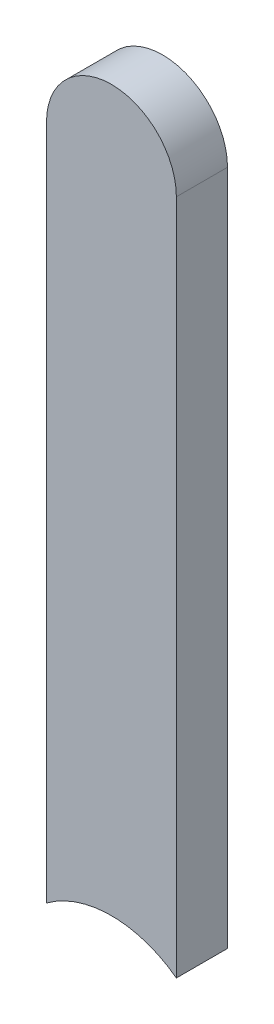
ISO-10303-21;
HEADER;
FILE_DESCRIPTION(('STEP AP214'),'2;1');
FILE_NAME('part.step','',(''),(''),'','','');
FILE_SCHEMA(('AUTOMOTIVE_DESIGN { 1 0 10303 214 1 1 1 1 }'));
ENDSEC;
DATA;
#1=APPLICATION_CONTEXT('core data for automotive mechanical design processes');
#2=APPLICATION_PROTOCOL_DEFINITION('international standard','automotive_design',2000,#1);
#3=PRODUCT_CONTEXT('',#1,'mechanical');
#4=PRODUCT('Part','Part','',(#3));
#5=PRODUCT_RELATED_PRODUCT_CATEGORY('part','',(#4));
#6=PRODUCT_DEFINITION_FORMATION('','',#4);
#7=PRODUCT_DEFINITION_CONTEXT('part definition',#1,'design');
#8=PRODUCT_DEFINITION('design','',#6,#7);
#9=PRODUCT_DEFINITION_SHAPE('','',#8);
#10=(LENGTH_UNIT() NAMED_UNIT(*) SI_UNIT(.MILLI.,.METRE.));
#11=(NAMED_UNIT(*) PLANE_ANGLE_UNIT() SI_UNIT($,.RADIAN.));
#12=(NAMED_UNIT(*) SI_UNIT($,.STERADIAN.) SOLID_ANGLE_UNIT());
#13=UNCERTAINTY_MEASURE_WITH_UNIT(LENGTH_MEASURE(1.E-05),#10,'distance_accuracy_value','');
#14=(GEOMETRIC_REPRESENTATION_CONTEXT(3) GLOBAL_UNCERTAINTY_ASSIGNED_CONTEXT((#13)) GLOBAL_UNIT_ASSIGNED_CONTEXT((#10,
#11,#12)) REPRESENTATION_CONTEXT('',''));
#15=CARTESIAN_POINT('',(0.,0.,0.));
#16=DIRECTION('',(0.,0.,1.));
#17=DIRECTION('',(1.,0.,0.));
#18=AXIS2_PLACEMENT_3D('',#15,#16,#17);
#19=CARTESIAN_POINT('',(110.744,108.732149431103,0.));
#20=DIRECTION('',(-1.,0.,0.));
#21=DIRECTION('',(0.,1.,0.));
#22=AXIS2_PLACEMENT_3D('',#19,#20,#21);
#23=PLANE('',#22);
#24=DIRECTION('',(0.,1.,0.));
#25=VECTOR('',#24,1.);
#26=CARTESIAN_POINT('',(110.744,108.3914012,0.1999996));
#27=LINE('',#26,#25);
#28=CARTESIAN_POINT('',(110.744,108.732149431103,0.1999996));
#29=VERTEX_POINT('',#28);
#30=CARTESIAN_POINT('',(110.744,111.379,0.1999996));
#31=VERTEX_POINT('',#30);
#32=EDGE_CURVE('E11',#29,#31,#27,.T.);
#33=ORIENTED_EDGE('',*,*,#32,.F.);
#34=DIRECTION('',(0.,0.,1.));
#35=VECTOR('',#34,1.);
#36=CARTESIAN_POINT('',(110.744,108.732149431103,0.));
#37=LINE('',#36,#35);
#38=CARTESIAN_POINT('',(110.744,108.732149431103,0.));
#39=VERTEX_POINT('',#38);
#40=EDGE_CURVE('E24',#39,#29,#37,.T.);
#41=ORIENTED_EDGE('',*,*,#40,.F.);
#42=DIRECTION('',(0.,1.,0.));
#43=VECTOR('',#42,1.);
#44=CARTESIAN_POINT('',(110.744,108.3914012,0.));
#45=LINE('',#44,#43);
#46=CARTESIAN_POINT('',(110.744,111.379,0.));
#47=VERTEX_POINT('',#46);
#48=EDGE_CURVE('E75',#39,#47,#45,.T.);
#49=ORIENTED_EDGE('',*,*,#48,.T.);
#50=DIRECTION('',(0.,0.,1.));
#51=VECTOR('',#50,1.);
#52=CARTESIAN_POINT('',(110.744,111.379,0.));
#53=LINE('',#52,#51);
#54=EDGE_CURVE('E37',#47,#31,#53,.T.);
#55=ORIENTED_EDGE('',*,*,#54,.T.);
#56=EDGE_LOOP('',(#33,#41,#49,#55));
#57=FACE_BOUND('',#56,.T.);
#58=ADVANCED_FACE('F17',(#57),#23,.F.);
#59=CARTESIAN_POINT('',(110.49,111.379,0.));
#60=DIRECTION('',(0.,0.,-1.));
#61=DIRECTION('',(1.,0.,0.));
#62=AXIS2_PLACEMENT_3D('',#59,#60,#61);
#63=CYLINDRICAL_SURFACE('',#62,0.253999999999995);
#64=CARTESIAN_POINT('',(110.49,111.379,0.1999996));
#65=DIRECTION('',(0.,0.,1.));
#66=DIRECTION('',(1.,0.,0.));
#67=AXIS2_PLACEMENT_3D('',#64,#65,#66);
#68=CIRCLE('',#67,0.253999999999995);
#69=CARTESIAN_POINT('',(110.236,111.379,0.1999996));
#70=VERTEX_POINT('',#69);
#71=EDGE_CURVE('E83',#31,#70,#68,.T.);
#72=ORIENTED_EDGE('',*,*,#71,.F.);
#73=ORIENTED_EDGE('',*,*,#54,.F.);
#74=CARTESIAN_POINT('',(110.49,111.379,0.));
#75=DIRECTION('',(0.,0.,1.));
#76=DIRECTION('',(1.,0.,0.));
#77=AXIS2_PLACEMENT_3D('',#74,#75,#76);
#78=CIRCLE('',#77,0.253999999999995);
#79=CARTESIAN_POINT('',(110.236,111.379,0.));
#80=VERTEX_POINT('',#79);
#81=EDGE_CURVE('E81',#47,#80,#78,.T.);
#82=ORIENTED_EDGE('',*,*,#81,.T.);
#83=DIRECTION('',(0.,0.,1.));
#84=VECTOR('',#83,1.);
#85=CARTESIAN_POINT('',(110.236,111.379,0.));
#86=LINE('',#85,#84);
#87=EDGE_CURVE('E67',#80,#70,#86,.T.);
#88=ORIENTED_EDGE('',*,*,#87,.T.);
#89=EDGE_LOOP('',(#72,#73,#82,#88));
#90=FACE_BOUND('',#89,.T.);
#91=ADVANCED_FACE('F89',(#90),#63,.T.);
#92=CARTESIAN_POINT('',(110.236,111.379,0.));
#93=DIRECTION('',(1.,0.,0.));
#94=DIRECTION('',(0.,-1.,0.));
#95=AXIS2_PLACEMENT_3D('',#92,#93,#94);
#96=PLANE('',#95);
#97=DIRECTION('',(0.,-1.,0.));
#98=VECTOR('',#97,1.);
#99=CARTESIAN_POINT('',(110.236,111.379,0.1999996));
#100=LINE('',#99,#98);
#101=CARTESIAN_POINT('',(110.236,108.732149431103,0.1999996));
#102=VERTEX_POINT('',#101);
#103=EDGE_CURVE('E71',#70,#102,#100,.T.);
#104=ORIENTED_EDGE('',*,*,#103,.F.);
#105=ORIENTED_EDGE('',*,*,#87,.F.);
#106=DIRECTION('',(0.,-1.,0.));
#107=VECTOR('',#106,1.);
#108=CARTESIAN_POINT('',(110.236,111.379,0.));
#109=LINE('',#108,#107);
#110=CARTESIAN_POINT('',(110.236,108.732149431103,0.));
#111=VERTEX_POINT('',#110);
#112=EDGE_CURVE('E63',#80,#111,#109,.T.);
#113=ORIENTED_EDGE('',*,*,#112,.T.);
#114=DIRECTION('',(0.,0.,1.));
#115=VECTOR('',#114,1.);
#116=CARTESIAN_POINT('',(110.236,108.732149431103,0.));
#117=LINE('',#116,#115);
#118=EDGE_CURVE('E53',#111,#102,#117,.T.);
#119=ORIENTED_EDGE('',*,*,#118,.T.);
#120=EDGE_LOOP('',(#104,#105,#113,#119));
#121=FACE_BOUND('',#120,.T.);
#122=ADVANCED_FACE('F66',(#121),#96,.F.);
#123=CARTESIAN_POINT('',(110.49,108.3914012,0.));
#124=DIRECTION('',(0.,0.,-1.));
#125=DIRECTION('',(1.,0.,0.));
#126=AXIS2_PLACEMENT_3D('',#123,#124,#125);
#127=CYLINDRICAL_SURFACE('',#126,0.42500042);
#128=ORIENTED_EDGE('',*,*,#40,.T.);
#129=CARTESIAN_POINT('',(110.49,108.3914012,0.1999996));
#130=DIRECTION('',(0.,0.,1.));
#131=DIRECTION('',(1.,0.,0.));
#132=AXIS2_PLACEMENT_3D('',#129,#130,#131);
#133=CIRCLE('',#132,0.42500042);
#134=EDGE_CURVE('E59',#29,#102,#133,.T.);
#135=ORIENTED_EDGE('',*,*,#134,.T.);
#136=ORIENTED_EDGE('',*,*,#118,.F.);
#137=CARTESIAN_POINT('',(110.49,108.3914012,0.));
#138=DIRECTION('',(0.,0.,1.));
#139=DIRECTION('',(1.,0.,0.));
#140=AXIS2_PLACEMENT_3D('',#137,#138,#139);
#141=CIRCLE('',#140,0.42500042);
#142=EDGE_CURVE('E57',#39,#111,#141,.T.);
#143=ORIENTED_EDGE('',*,*,#142,.F.);
#144=EDGE_LOOP('',(#128,#135,#136,#143));
#145=FACE_BOUND('',#144,.T.);
#146=ADVANCED_FACE('F55',(#145),#127,.F.);
#147=CARTESIAN_POINT('',(110.744,108.3914012,0.));
#148=DIRECTION('',(0.,0.,-1.));
#149=DIRECTION('',(-1.,0.,0.));
#150=AXIS2_PLACEMENT_3D('',#147,#148,#149);
#151=PLANE('',#150);
#152=ORIENTED_EDGE('',*,*,#48,.F.);
#153=ORIENTED_EDGE('',*,*,#142,.T.);
#154=ORIENTED_EDGE('',*,*,#112,.F.);
#155=ORIENTED_EDGE('',*,*,#81,.F.);
#156=EDGE_LOOP('',(#152,#153,#154,#155));
#157=FACE_BOUND('',#156,.T.);
#158=ADVANCED_FACE('F74',(#157),#151,.T.);
#159=CARTESIAN_POINT('',(110.744,108.3914012,0.1999996));
#160=DIRECTION('',(0.,0.,-1.));
#161=DIRECTION('',(-1.,0.,0.));
#162=AXIS2_PLACEMENT_3D('',#159,#160,#161);
#163=PLANE('',#162);
#164=ORIENTED_EDGE('',*,*,#134,.F.);
#165=ORIENTED_EDGE('',*,*,#32,.T.);
#166=ORIENTED_EDGE('',*,*,#71,.T.);
#167=ORIENTED_EDGE('',*,*,#103,.T.);
#168=EDGE_LOOP('',(#164,#165,#166,#167));
#169=FACE_BOUND('',#168,.T.);
#170=ADVANCED_FACE('F91',(#169),#163,.F.);
#171=CLOSED_SHELL('',(#58,#91,#122,#146,#158,#170));
#172=MANIFOLD_SOLID_BREP('B1',#171);
#173=ADVANCED_BREP_SHAPE_REPRESENTATION('',(#18,#172),#14);
#174=SHAPE_DEFINITION_REPRESENTATION(#9,#173);
ENDSEC;
END-ISO-10303-21;
